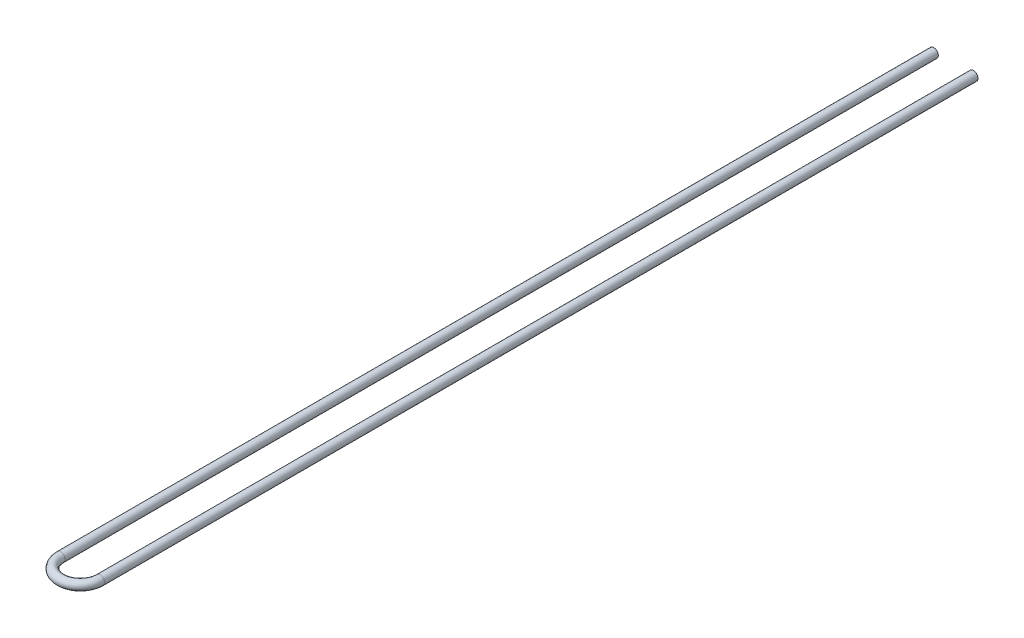
ISO-10303-21;
HEADER;
FILE_DESCRIPTION(('STEP AP214'),'2;1');
FILE_NAME('part.step','',(''),(''),'','','');
FILE_SCHEMA(('AUTOMOTIVE_DESIGN { 1 0 10303 214 1 1 1 1 }'));
ENDSEC;
DATA;
#1=APPLICATION_CONTEXT('core data for automotive mechanical design processes');
#2=APPLICATION_PROTOCOL_DEFINITION('international standard','automotive_design',2000,#1);
#3=PRODUCT_CONTEXT('',#1,'mechanical');
#4=PRODUCT('Part','Part','',(#3));
#5=PRODUCT_RELATED_PRODUCT_CATEGORY('part','',(#4));
#6=PRODUCT_DEFINITION_FORMATION('','',#4);
#7=PRODUCT_DEFINITION_CONTEXT('part definition',#1,'design');
#8=PRODUCT_DEFINITION('design','',#6,#7);
#9=PRODUCT_DEFINITION_SHAPE('','',#8);
#10=(LENGTH_UNIT() NAMED_UNIT(*) SI_UNIT(.MILLI.,.METRE.));
#11=(NAMED_UNIT(*) PLANE_ANGLE_UNIT() SI_UNIT($,.RADIAN.));
#12=(NAMED_UNIT(*) SI_UNIT($,.STERADIAN.) SOLID_ANGLE_UNIT());
#13=UNCERTAINTY_MEASURE_WITH_UNIT(LENGTH_MEASURE(1.E-05),#10,'distance_accuracy_value','');
#14=(GEOMETRIC_REPRESENTATION_CONTEXT(3) GLOBAL_UNCERTAINTY_ASSIGNED_CONTEXT((#13)) GLOBAL_UNIT_ASSIGNED_CONTEXT((#10,
#11,#12)) REPRESENTATION_CONTEXT('',''));
#15=CARTESIAN_POINT('',(0.,0.,0.));
#16=DIRECTION('',(0.,0.,1.));
#17=DIRECTION('',(1.,0.,0.));
#18=AXIS2_PLACEMENT_3D('',#15,#16,#17);
#19=CARTESIAN_POINT('',(-40.,0.,299.999999999999));
#20=DIRECTION('',(0.,0.,1.));
#21=DIRECTION('',(1.,0.,0.));
#22=AXIS2_PLACEMENT_3D('',#19,#20,#21);
#23=CYLINDRICAL_SURFACE('',#22,11.1);
#24=CARTESIAN_POINT('',(-39.9999999999997,0.,2440.));
#25=DIRECTION('',(0.,0.,1.));
#26=DIRECTION('',(1.,0.,0.));
#27=AXIS2_PLACEMENT_3D('',#24,#25,#26);
#28=CIRCLE('',#27,11.1);
#29=CARTESIAN_POINT('',(-51.0999999999997,0.,2440.));
#30=VERTEX_POINT('',#29);
#31=EDGE_CURVE('E54',#30,#30,#28,.T.);
#32=ORIENTED_EDGE('',*,*,#31,.F.);
#33=EDGE_LOOP('',(#32));
#34=FACE_BOUND('',#33,.T.);
#35=CARTESIAN_POINT('',(-40.,0.,299.999999999999));
#36=DIRECTION('',(0.,0.,1.));
#37=DIRECTION('',(1.,0.,0.));
#38=AXIS2_PLACEMENT_3D('',#35,#36,#37);
#39=CIRCLE('',#38,11.1);
#40=CARTESIAN_POINT('',(-28.9,0.,299.999999999999));
#41=VERTEX_POINT('',#40);
#42=EDGE_CURVE('E52',#41,#41,#39,.T.);
#43=ORIENTED_EDGE('',*,*,#42,.T.);
#44=EDGE_LOOP('',(#43));
#45=FACE_BOUND('',#44,.T.);
#46=ADVANCED_FACE('F31',(#34,#45),#23,.T.);
#47=CARTESIAN_POINT('',(8.6150000000003,0.,2440.));
#48=DIRECTION('',(0.,1.,0.));
#49=DIRECTION('',(0.,0.,1.));
#50=AXIS2_PLACEMENT_3D('',#47,#48,#49);
#51=TOROIDAL_SURFACE('',#50,48.615,11.1);
#52=CARTESIAN_POINT('',(57.2300000000003,0.,2440.));
#53=DIRECTION('',(0.,0.,-1.));
#54=DIRECTION('',(-1.,0.,0.));
#55=AXIS2_PLACEMENT_3D('',#52,#53,#54);
#56=CIRCLE('',#55,11.1);
#57=CARTESIAN_POINT('',(68.3300000000003,0.,2440.));
#58=VERTEX_POINT('',#57);
#59=EDGE_CURVE('E35',#58,#58,#56,.T.);
#60=CARTESIAN_POINT('',(8.6150000000003,0.,2440.));
#61=DIRECTION('',(0.,1.,0.));
#62=DIRECTION('',(0.,0.,1.));
#63=AXIS2_PLACEMENT_3D('',#60,#61,#62);
#64=CIRCLE('',#63,59.715);
#65=EDGE_CURVE('',#30,#58,#64,.T.);
#66=ORIENTED_EDGE('',*,*,#31,.T.);
#67=ORIENTED_EDGE('',*,*,#59,.F.);
#68=ORIENTED_EDGE('',*,*,#65,.T.);
#69=ORIENTED_EDGE('',*,*,#65,.F.);
#70=EDGE_LOOP('',(#66,#68,#67,#69));
#71=FACE_BOUND('',#70,.T.);
#72=ADVANCED_FACE('F62',(#71),#51,.T.);
#73=CARTESIAN_POINT('',(57.2300000000003,0.,2440.));
#74=DIRECTION('',(0.,0.,-1.));
#75=DIRECTION('',(-1.,0.,0.));
#76=AXIS2_PLACEMENT_3D('',#73,#74,#75);
#77=CYLINDRICAL_SURFACE('',#76,11.1);
#78=CARTESIAN_POINT('',(57.23,0.,299.999999999999));
#79=DIRECTION('',(0.,0.,-1.));
#80=DIRECTION('',(-1.,0.,0.));
#81=AXIS2_PLACEMENT_3D('',#78,#79,#80);
#82=CIRCLE('',#81,11.1);
#83=CARTESIAN_POINT('',(46.13,0.,299.999999999999));
#84=VERTEX_POINT('',#83);
#85=EDGE_CURVE('E48',#84,#84,#82,.T.);
#86=ORIENTED_EDGE('',*,*,#85,.F.);
#87=EDGE_LOOP('',(#86));
#88=FACE_BOUND('',#87,.T.);
#89=ORIENTED_EDGE('',*,*,#59,.T.);
#90=EDGE_LOOP('',(#89));
#91=FACE_BOUND('',#90,.T.);
#92=ADVANCED_FACE('F33',(#88,#91),#77,.T.);
#93=CARTESIAN_POINT('',(-40.,0.,299.999999999999));
#94=DIRECTION('',(0.,0.,1.));
#95=DIRECTION('',(1.,0.,0.));
#96=AXIS2_PLACEMENT_3D('',#93,#94,#95);
#97=PLANE('',#96);
#98=CARTESIAN_POINT('',(-40.,0.,299.999999999999));
#99=DIRECTION('',(0.,0.,1.));
#100=DIRECTION('',(1.,0.,0.));
#101=AXIS2_PLACEMENT_3D('',#98,#99,#100);
#102=CIRCLE('',#101,9.95);
#103=CARTESIAN_POINT('',(-30.05,0.,299.999999999999));
#104=VERTEX_POINT('',#103);
#105=EDGE_CURVE('E51',#104,#104,#102,.F.);
#106=ORIENTED_EDGE('',*,*,#105,.F.);
#107=EDGE_LOOP('',(#106));
#108=FACE_BOUND('',#107,.T.);
#109=ORIENTED_EDGE('',*,*,#42,.F.);
#110=EDGE_LOOP('',(#109));
#111=FACE_BOUND('',#110,.T.);
#112=ADVANCED_FACE('F68',(#108,#111),#97,.F.);
#113=CARTESIAN_POINT('',(57.23,0.,299.999999999999));
#114=DIRECTION('',(0.,0.,-1.));
#115=DIRECTION('',(-1.,0.,0.));
#116=AXIS2_PLACEMENT_3D('',#113,#114,#115);
#117=PLANE('',#116);
#118=CARTESIAN_POINT('',(57.23,0.,299.999999999999));
#119=DIRECTION('',(0.,0.,-1.));
#120=DIRECTION('',(-1.,0.,0.));
#121=AXIS2_PLACEMENT_3D('',#118,#119,#120);
#122=CIRCLE('',#121,9.95);
#123=CARTESIAN_POINT('',(47.28,0.,299.999999999999));
#124=VERTEX_POINT('',#123);
#125=EDGE_CURVE('E10',#124,#124,#122,.F.);
#126=ORIENTED_EDGE('',*,*,#125,.T.);
#127=EDGE_LOOP('',(#126));
#128=FACE_BOUND('',#127,.T.);
#129=ORIENTED_EDGE('',*,*,#85,.T.);
#130=EDGE_LOOP('',(#129));
#131=FACE_BOUND('',#130,.T.);
#132=ADVANCED_FACE('F86',(#128,#131),#117,.T.);
#133=CARTESIAN_POINT('',(-40.,0.,299.999999999999));
#134=DIRECTION('',(0.,0.,1.));
#135=DIRECTION('',(1.,0.,0.));
#136=AXIS2_PLACEMENT_3D('',#133,#134,#135);
#137=CYLINDRICAL_SURFACE('',#136,9.95);
#138=CARTESIAN_POINT('',(-39.9999999999997,0.,2440.));
#139=DIRECTION('',(0.,0.,1.));
#140=DIRECTION('',(1.,0.,0.));
#141=AXIS2_PLACEMENT_3D('',#138,#139,#140);
#142=CIRCLE('',#141,9.95);
#143=CARTESIAN_POINT('',(-49.9499999999997,0.,2440.));
#144=VERTEX_POINT('',#143);
#145=EDGE_CURVE('E44',#144,#144,#142,.F.);
#146=ORIENTED_EDGE('',*,*,#145,.F.);
#147=EDGE_LOOP('',(#146));
#148=FACE_BOUND('',#147,.T.);
#149=ORIENTED_EDGE('',*,*,#105,.T.);
#150=EDGE_LOOP('',(#149));
#151=FACE_BOUND('',#150,.T.);
#152=ADVANCED_FACE('F80',(#148,#151),#137,.F.);
#153=CARTESIAN_POINT('',(8.6150000000003,0.,2440.));
#154=DIRECTION('',(0.,1.,0.));
#155=DIRECTION('',(0.,0.,1.));
#156=AXIS2_PLACEMENT_3D('',#153,#154,#155);
#157=TOROIDAL_SURFACE('',#156,48.615,9.95);
#158=CARTESIAN_POINT('',(57.2300000000003,0.,2440.));
#159=DIRECTION('',(0.,0.,-1.));
#160=DIRECTION('',(-1.,0.,0.));
#161=AXIS2_PLACEMENT_3D('',#158,#159,#160);
#162=CIRCLE('',#161,9.95);
#163=CARTESIAN_POINT('',(67.1800000000003,0.,2440.));
#164=VERTEX_POINT('',#163);
#165=EDGE_CURVE('E39',#164,#164,#162,.F.);
#166=CARTESIAN_POINT('',(8.6150000000003,0.,2440.));
#167=DIRECTION('',(0.,1.,0.));
#168=DIRECTION('',(0.,0.,1.));
#169=AXIS2_PLACEMENT_3D('',#166,#167,#168);
#170=CIRCLE('',#169,58.565);
#171=EDGE_CURVE('',#144,#164,#170,.T.);
#172=ORIENTED_EDGE('',*,*,#145,.T.);
#173=ORIENTED_EDGE('',*,*,#165,.F.);
#174=ORIENTED_EDGE('',*,*,#171,.T.);
#175=ORIENTED_EDGE('',*,*,#171,.F.);
#176=EDGE_LOOP('',(#172,#174,#173,#175));
#177=FACE_BOUND('',#176,.T.);
#178=ADVANCED_FACE('F74',(#177),#157,.F.);
#179=CARTESIAN_POINT('',(57.2300000000003,0.,2440.));
#180=DIRECTION('',(0.,0.,-1.));
#181=DIRECTION('',(-1.,0.,0.));
#182=AXIS2_PLACEMENT_3D('',#179,#180,#181);
#183=CYLINDRICAL_SURFACE('',#182,9.95);
#184=ORIENTED_EDGE('',*,*,#125,.F.);
#185=EDGE_LOOP('',(#184));
#186=FACE_BOUND('',#185,.T.);
#187=ORIENTED_EDGE('',*,*,#165,.T.);
#188=EDGE_LOOP('',(#187));
#189=FACE_BOUND('',#188,.T.);
#190=ADVANCED_FACE('F72',(#186,#189),#183,.F.);
#191=CLOSED_SHELL('',(#46,#72,#92,#112,#132,#152,#178,#190));
#192=MANIFOLD_SOLID_BREP('B2',#191);
#193=ADVANCED_BREP_SHAPE_REPRESENTATION('',(#18,#192),#14);
#194=SHAPE_DEFINITION_REPRESENTATION(#9,#193);
ENDSEC;
END-ISO-10303-21;
